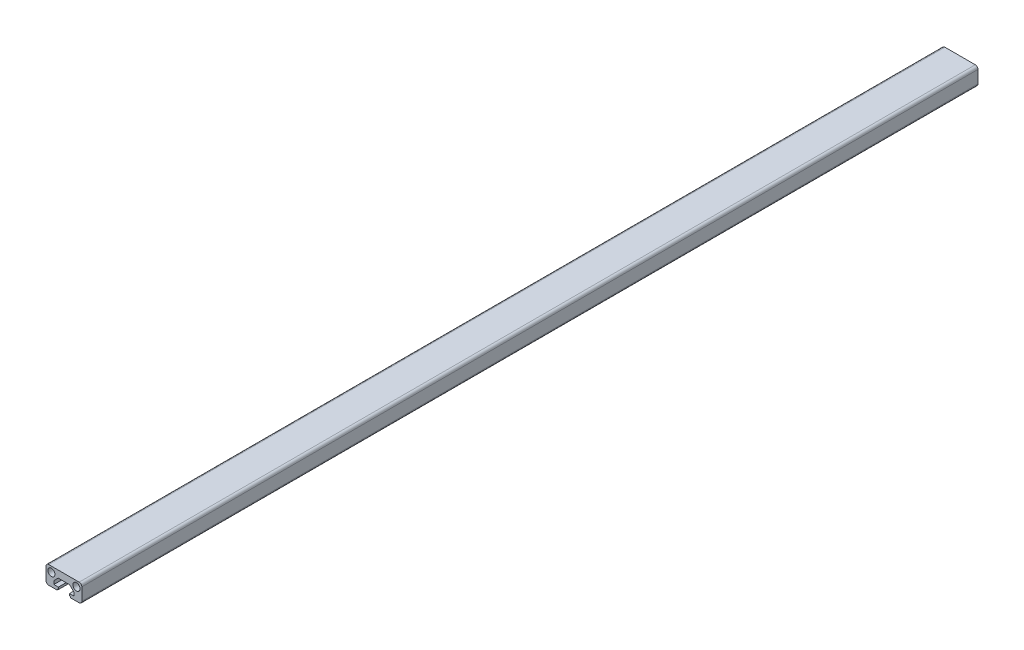
ISO-10303-21;
HEADER;
FILE_DESCRIPTION(('STEP AP214'),'2;1');
FILE_NAME('part.step','',(''),(''),'','','');
FILE_SCHEMA(('AUTOMOTIVE_DESIGN { 1 0 10303 214 1 1 1 1 }'));
ENDSEC;
DATA;
#1=APPLICATION_CONTEXT('core data for automotive mechanical design processes');
#2=APPLICATION_PROTOCOL_DEFINITION('international standard','automotive_design',2000,#1);
#3=PRODUCT_CONTEXT('',#1,'mechanical');
#4=PRODUCT('Part','Part','',(#3));
#5=PRODUCT_RELATED_PRODUCT_CATEGORY('part','',(#4));
#6=PRODUCT_DEFINITION_FORMATION('','',#4);
#7=PRODUCT_DEFINITION_CONTEXT('part definition',#1,'design');
#8=PRODUCT_DEFINITION('design','',#6,#7);
#9=PRODUCT_DEFINITION_SHAPE('','',#8);
#10=(LENGTH_UNIT() NAMED_UNIT(*) SI_UNIT(.MILLI.,.METRE.));
#11=(NAMED_UNIT(*) PLANE_ANGLE_UNIT() SI_UNIT($,.RADIAN.));
#12=(NAMED_UNIT(*) SI_UNIT($,.STERADIAN.) SOLID_ANGLE_UNIT());
#13=UNCERTAINTY_MEASURE_WITH_UNIT(LENGTH_MEASURE(1.E-05),#10,'distance_accuracy_value','');
#14=(GEOMETRIC_REPRESENTATION_CONTEXT(3) GLOBAL_UNCERTAINTY_ASSIGNED_CONTEXT((#13)) GLOBAL_UNIT_ASSIGNED_CONTEXT((#10,
#11,#12)) REPRESENTATION_CONTEXT('',''));
#15=CARTESIAN_POINT('',(0.,0.,0.));
#16=DIRECTION('',(0.,0.,1.));
#17=DIRECTION('',(1.,0.,0.));
#18=AXIS2_PLACEMENT_3D('',#15,#16,#17);
#19=CARTESIAN_POINT('',(3.95000000000001,0.300000000000022,250.));
#20=DIRECTION('',(0.,0.,1.));
#21=DIRECTION('',(1.,0.,0.));
#22=AXIS2_PLACEMENT_3D('',#19,#20,#21);
#23=PLANE('',#22);
#24=CARTESIAN_POINT('',(-7.,7.,250.));
#25=DIRECTION('',(0.,0.,1.));
#26=DIRECTION('',(1.,0.,0.));
#27=AXIS2_PLACEMENT_3D('',#24,#25,#26);
#28=CIRCLE('',#27,2.);
#29=CARTESIAN_POINT('',(-5.,7.,250.));
#30=VERTEX_POINT('',#29);
#31=EDGE_CURVE('E234',#30,#30,#28,.T.);
#32=ORIENTED_EDGE('',*,*,#31,.F.);
#33=EDGE_LOOP('',(#32));
#34=FACE_BOUND('',#33,.T.);
#35=DIRECTION('',(1.,0.,0.));
#36=VECTOR('',#35,1.);
#37=CARTESIAN_POINT('',(-3.65,0.6,250.));
#38=LINE('',#37,#36);
#39=CARTESIAN_POINT('',(-3.65,0.6,250.));
#40=VERTEX_POINT('',#39);
#41=CARTESIAN_POINT('',(-3.1,0.6,250.));
#42=VERTEX_POINT('',#41);
#43=EDGE_CURVE('E277',#40,#42,#38,.T.);
#44=ORIENTED_EDGE('',*,*,#43,.T.);
#45=DIRECTION('',(0.,1.,0.));
#46=VECTOR('',#45,1.);
#47=CARTESIAN_POINT('',(-3.1,0.6,250.));
#48=LINE('',#47,#46);
#49=CARTESIAN_POINT('',(-3.1,1.8,250.));
#50=VERTEX_POINT('',#49);
#51=EDGE_CURVE('E145',#42,#50,#48,.T.);
#52=ORIENTED_EDGE('',*,*,#51,.T.);
#53=DIRECTION('',(-1.,0.,0.));
#54=VECTOR('',#53,1.);
#55=CARTESIAN_POINT('',(-3.1,1.8,250.));
#56=LINE('',#55,#54);
#57=CARTESIAN_POINT('',(-5.6,1.8,250.));
#58=VERTEX_POINT('',#57);
#59=EDGE_CURVE('E340',#50,#58,#56,.T.);
#60=ORIENTED_EDGE('',*,*,#59,.T.);
#61=DIRECTION('',(0.,1.,0.));
#62=VECTOR('',#61,1.);
#63=CARTESIAN_POINT('',(-5.6,1.8,250.));
#64=LINE('',#63,#62);
#65=CARTESIAN_POINT('',(-5.6,3.69289321881342,250.));
#66=VERTEX_POINT('',#65);
#67=EDGE_CURVE('E359',#58,#66,#64,.T.);
#68=ORIENTED_EDGE('',*,*,#67,.T.);
#69=DIRECTION('',(0.707106781186543,0.707106781186552,0.));
#70=VECTOR('',#69,1.);
#71=CARTESIAN_POINT('',(-5.6,3.69289321881342,250.));
#72=LINE('',#71,#70);
#73=CARTESIAN_POINT('',(-3.19289321881345,6.1,250.));
#74=VERTEX_POINT('',#73);
#75=EDGE_CURVE('E356',#66,#74,#72,.T.);
#76=ORIENTED_EDGE('',*,*,#75,.T.);
#77=DIRECTION('',(1.,0.,0.));
#78=VECTOR('',#77,1.);
#79=CARTESIAN_POINT('',(-3.19289321881345,6.1,250.));
#80=LINE('',#79,#78);
#81=CARTESIAN_POINT('',(3.19289321881345,6.1,250.));
#82=VERTEX_POINT('',#81);
#83=EDGE_CURVE('E358',#74,#82,#80,.T.);
#84=ORIENTED_EDGE('',*,*,#83,.T.);
#85=DIRECTION('',(0.707106781186544,-0.707106781186551,0.));
#86=VECTOR('',#85,1.);
#87=CARTESIAN_POINT('',(5.6,3.69289321881343,250.));
#88=LINE('',#87,#86);
#89=CARTESIAN_POINT('',(5.6,3.69289321881343,250.));
#90=VERTEX_POINT('',#89);
#91=EDGE_CURVE('E361',#82,#90,#88,.T.);
#92=ORIENTED_EDGE('',*,*,#91,.T.);
#93=DIRECTION('',(0.,-1.,0.));
#94=VECTOR('',#93,1.);
#95=CARTESIAN_POINT('',(5.6,1.8,250.));
#96=LINE('',#95,#94);
#97=CARTESIAN_POINT('',(5.6,1.8,250.));
#98=VERTEX_POINT('',#97);
#99=EDGE_CURVE('E367',#90,#98,#96,.T.);
#100=ORIENTED_EDGE('',*,*,#99,.T.);
#101=DIRECTION('',(-1.,0.,0.));
#102=VECTOR('',#101,1.);
#103=CARTESIAN_POINT('',(3.1,1.8,250.));
#104=LINE('',#103,#102);
#105=CARTESIAN_POINT('',(3.1,1.8,250.));
#106=VERTEX_POINT('',#105);
#107=EDGE_CURVE('E369',#98,#106,#104,.T.);
#108=ORIENTED_EDGE('',*,*,#107,.T.);
#109=DIRECTION('',(0.,-1.,0.));
#110=VECTOR('',#109,1.);
#111=CARTESIAN_POINT('',(3.1,0.6,250.));
#112=LINE('',#111,#110);
#113=CARTESIAN_POINT('',(3.1,0.6,250.));
#114=VERTEX_POINT('',#113);
#115=EDGE_CURVE('E371',#106,#114,#112,.T.);
#116=ORIENTED_EDGE('',*,*,#115,.T.);
#117=DIRECTION('',(1.,0.,0.));
#118=VECTOR('',#117,1.);
#119=CARTESIAN_POINT('',(3.65,0.6,250.));
#120=LINE('',#119,#118);
#121=CARTESIAN_POINT('',(3.65,0.6,250.));
#122=VERTEX_POINT('',#121);
#123=EDGE_CURVE('E373',#114,#122,#120,.T.);
#124=ORIENTED_EDGE('',*,*,#123,.T.);
#125=DIRECTION('',(0.,-1.,0.));
#126=VECTOR('',#125,1.);
#127=CARTESIAN_POINT('',(3.65,0.300000000000022,250.));
#128=LINE('',#127,#126);
#129=CARTESIAN_POINT('',(3.64999999999999,0.300000000000023,250.));
#130=VERTEX_POINT('',#129);
#131=EDGE_CURVE('E375',#122,#130,#128,.T.);
#132=ORIENTED_EDGE('',*,*,#131,.T.);
#133=CARTESIAN_POINT('',(3.95000000000001,0.300000000000022,250.));
#134=DIRECTION('',(0.,0.,1.));
#135=DIRECTION('',(1.,0.,0.));
#136=AXIS2_PLACEMENT_3D('',#133,#134,#135);
#137=CIRCLE('',#136,0.300000000000016);
#138=CARTESIAN_POINT('',(3.95000000000006,0.,250.));
#139=VERTEX_POINT('',#138);
#140=EDGE_CURVE('E377',#130,#139,#137,.T.);
#141=ORIENTED_EDGE('',*,*,#140,.T.);
#142=DIRECTION('',(1.,0.,0.));
#143=VECTOR('',#142,1.);
#144=CARTESIAN_POINT('',(8.49999999999999,0.,250.));
#145=LINE('',#144,#143);
#146=CARTESIAN_POINT('',(8.49999999999999,0.,250.));
#147=VERTEX_POINT('',#146);
#148=EDGE_CURVE('E379',#139,#147,#145,.T.);
#149=ORIENTED_EDGE('',*,*,#148,.T.);
#150=CARTESIAN_POINT('',(8.5,1.5,250.));
#151=DIRECTION('',(0.,0.,1.));
#152=DIRECTION('',(1.,0.,0.));
#153=AXIS2_PLACEMENT_3D('',#150,#151,#152);
#154=CIRCLE('',#153,1.5);
#155=CARTESIAN_POINT('',(10.,1.50000000000001,250.));
#156=VERTEX_POINT('',#155);
#157=EDGE_CURVE('E381',#147,#156,#154,.T.);
#158=ORIENTED_EDGE('',*,*,#157,.T.);
#159=DIRECTION('',(0.,1.,0.));
#160=VECTOR('',#159,1.);
#161=CARTESIAN_POINT('',(10.,8.49999999999999,250.));
#162=LINE('',#161,#160);
#163=CARTESIAN_POINT('',(10.,8.49999999999999,250.));
#164=VERTEX_POINT('',#163);
#165=EDGE_CURVE('E383',#156,#164,#162,.T.);
#166=ORIENTED_EDGE('',*,*,#165,.T.);
#167=CARTESIAN_POINT('',(8.5,8.5,250.));
#168=DIRECTION('',(0.,0.,1.));
#169=DIRECTION('',(-1.,0.,0.));
#170=AXIS2_PLACEMENT_3D('',#167,#168,#169);
#171=CIRCLE('',#170,1.5);
#172=CARTESIAN_POINT('',(8.49999999999999,10.,250.));
#173=VERTEX_POINT('',#172);
#174=EDGE_CURVE('E385',#164,#173,#171,.T.);
#175=ORIENTED_EDGE('',*,*,#174,.T.);
#176=DIRECTION('',(-1.,0.,0.));
#177=VECTOR('',#176,1.);
#178=CARTESIAN_POINT('',(8.49999999999999,10.,250.));
#179=LINE('',#178,#177);
#180=CARTESIAN_POINT('',(-8.49999999999999,10.,250.));
#181=VERTEX_POINT('',#180);
#182=EDGE_CURVE('E387',#173,#181,#179,.T.);
#183=ORIENTED_EDGE('',*,*,#182,.T.);
#184=CARTESIAN_POINT('',(-8.5,8.5,250.));
#185=DIRECTION('',(0.,0.,1.));
#186=DIRECTION('',(1.,0.,0.));
#187=AXIS2_PLACEMENT_3D('',#184,#185,#186);
#188=CIRCLE('',#187,1.5);
#189=CARTESIAN_POINT('',(-10.,8.49999999999999,250.));
#190=VERTEX_POINT('',#189);
#191=EDGE_CURVE('E389',#181,#190,#188,.T.);
#192=ORIENTED_EDGE('',*,*,#191,.T.);
#193=DIRECTION('',(0.,-1.,0.));
#194=VECTOR('',#193,1.);
#195=CARTESIAN_POINT('',(-10.,8.49999999999999,250.));
#196=LINE('',#195,#194);
#197=CARTESIAN_POINT('',(-10.,1.5,250.));
#198=VERTEX_POINT('',#197);
#199=EDGE_CURVE('E391',#190,#198,#196,.T.);
#200=ORIENTED_EDGE('',*,*,#199,.T.);
#201=CARTESIAN_POINT('',(-8.5,1.5,250.));
#202=DIRECTION('',(0.,0.,1.));
#203=DIRECTION('',(-1.,0.,0.));
#204=AXIS2_PLACEMENT_3D('',#201,#202,#203);
#205=CIRCLE('',#204,1.5);
#206=CARTESIAN_POINT('',(-8.49999999999999,0.,250.));
#207=VERTEX_POINT('',#206);
#208=EDGE_CURVE('E212',#198,#207,#205,.T.);
#209=ORIENTED_EDGE('',*,*,#208,.T.);
#210=DIRECTION('',(1.,0.,0.));
#211=VECTOR('',#210,1.);
#212=CARTESIAN_POINT('',(-8.49999999999999,0.,250.));
#213=LINE('',#212,#211);
#214=CARTESIAN_POINT('',(-3.95000000000006,0.,250.));
#215=VERTEX_POINT('',#214);
#216=EDGE_CURVE('E206',#207,#215,#213,.T.);
#217=ORIENTED_EDGE('',*,*,#216,.T.);
#218=CARTESIAN_POINT('',(-3.95000000000001,0.300000000000022,250.));
#219=DIRECTION('',(0.,0.,1.));
#220=DIRECTION('',(1.,0.,0.));
#221=AXIS2_PLACEMENT_3D('',#218,#219,#220);
#222=CIRCLE('',#221,0.300000000000016);
#223=CARTESIAN_POINT('',(-3.65,0.300000000000022,250.));
#224=VERTEX_POINT('',#223);
#225=EDGE_CURVE('E210',#215,#224,#222,.T.);
#226=ORIENTED_EDGE('',*,*,#225,.T.);
#227=DIRECTION('',(0.,1.,0.));
#228=VECTOR('',#227,1.);
#229=CARTESIAN_POINT('',(-3.65,0.300000000000022,250.));
#230=LINE('',#229,#228);
#231=EDGE_CURVE('E54',#224,#40,#230,.T.);
#232=ORIENTED_EDGE('',*,*,#231,.T.);
#233=EDGE_LOOP('',(#44,#52,#60,#68,#76,#84,#92,#100,#108,#116,#124,#132,#141,#149,#158,#166,
#175,#183,#192,#200,#209,#217,#226,#232));
#234=FACE_BOUND('',#233,.T.);
#235=CARTESIAN_POINT('',(7.,7.,250.));
#236=DIRECTION('',(0.,0.,1.));
#237=DIRECTION('',(-1.,0.,0.));
#238=AXIS2_PLACEMENT_3D('',#235,#236,#237);
#239=CIRCLE('',#238,2.);
#240=CARTESIAN_POINT('',(5.,7.,250.));
#241=VERTEX_POINT('',#240);
#242=EDGE_CURVE('E433',#241,#241,#239,.T.);
#243=ORIENTED_EDGE('',*,*,#242,.F.);
#244=EDGE_LOOP('',(#243));
#245=FACE_BOUND('',#244,.T.);
#246=ADVANCED_FACE('F37',(#34,#234,#245),#23,.T.);
#247=CARTESIAN_POINT('',(3.95000000000001,0.300000000000022,-250.));
#248=DIRECTION('',(0.,0.,1.));
#249=DIRECTION('',(1.,0.,0.));
#250=AXIS2_PLACEMENT_3D('',#247,#248,#249);
#251=PLANE('',#250);
#252=DIRECTION('',(1.,0.,0.));
#253=VECTOR('',#252,1.);
#254=CARTESIAN_POINT('',(-3.65,0.6,-250.));
#255=LINE('',#254,#253);
#256=CARTESIAN_POINT('',(-3.65,0.6,-250.));
#257=VERTEX_POINT('',#256);
#258=CARTESIAN_POINT('',(-3.1,0.6,-250.));
#259=VERTEX_POINT('',#258);
#260=EDGE_CURVE('E230',#257,#259,#255,.T.);
#261=ORIENTED_EDGE('',*,*,#260,.F.);
#262=DIRECTION('',(0.,1.,0.));
#263=VECTOR('',#262,1.);
#264=CARTESIAN_POINT('',(-3.65,0.300000000000022,-250.));
#265=LINE('',#264,#263);
#266=CARTESIAN_POINT('',(-3.65,0.300000000000022,-250.));
#267=VERTEX_POINT('',#266);
#268=EDGE_CURVE('E137',#267,#257,#265,.T.);
#269=ORIENTED_EDGE('',*,*,#268,.F.);
#270=CARTESIAN_POINT('',(-3.95000000000001,0.300000000000022,-250.));
#271=DIRECTION('',(0.,0.,1.));
#272=DIRECTION('',(1.,0.,0.));
#273=AXIS2_PLACEMENT_3D('',#270,#271,#272);
#274=CIRCLE('',#273,0.300000000000016);
#275=CARTESIAN_POINT('',(-3.95000000000006,0.,-250.));
#276=VERTEX_POINT('',#275);
#277=EDGE_CURVE('E131',#276,#267,#274,.T.);
#278=ORIENTED_EDGE('',*,*,#277,.F.);
#279=DIRECTION('',(1.,0.,0.));
#280=VECTOR('',#279,1.);
#281=CARTESIAN_POINT('',(-8.49999999999999,0.,-250.));
#282=LINE('',#281,#280);
#283=CARTESIAN_POINT('',(-8.49999999999999,0.,-250.));
#284=VERTEX_POINT('',#283);
#285=EDGE_CURVE('E220',#284,#276,#282,.T.);
#286=ORIENTED_EDGE('',*,*,#285,.F.);
#287=CARTESIAN_POINT('',(-8.5,1.5,-250.));
#288=DIRECTION('',(0.,0.,1.));
#289=DIRECTION('',(-1.,0.,0.));
#290=AXIS2_PLACEMENT_3D('',#287,#288,#289);
#291=CIRCLE('',#290,1.5);
#292=CARTESIAN_POINT('',(-10.,1.5,-250.));
#293=VERTEX_POINT('',#292);
#294=EDGE_CURVE('E272',#293,#284,#291,.T.);
#295=ORIENTED_EDGE('',*,*,#294,.F.);
#296=DIRECTION('',(0.,-1.,0.));
#297=VECTOR('',#296,1.);
#298=CARTESIAN_POINT('',(-10.,8.49999999999999,-250.));
#299=LINE('',#298,#297);
#300=CARTESIAN_POINT('',(-10.,8.49999999999999,-250.));
#301=VERTEX_POINT('',#300);
#302=EDGE_CURVE('E270',#301,#293,#299,.T.);
#303=ORIENTED_EDGE('',*,*,#302,.F.);
#304=CARTESIAN_POINT('',(-8.5,8.5,-250.));
#305=DIRECTION('',(0.,0.,1.));
#306=DIRECTION('',(1.,0.,0.));
#307=AXIS2_PLACEMENT_3D('',#304,#305,#306);
#308=CIRCLE('',#307,1.5);
#309=CARTESIAN_POINT('',(-8.49999999999999,10.,-250.));
#310=VERTEX_POINT('',#309);
#311=EDGE_CURVE('E268',#310,#301,#308,.T.);
#312=ORIENTED_EDGE('',*,*,#311,.F.);
#313=DIRECTION('',(-1.,0.,0.));
#314=VECTOR('',#313,1.);
#315=CARTESIAN_POINT('',(8.49999999999999,10.,-250.));
#316=LINE('',#315,#314);
#317=CARTESIAN_POINT('',(8.49999999999999,10.,-250.));
#318=VERTEX_POINT('',#317);
#319=EDGE_CURVE('E266',#318,#310,#316,.T.);
#320=ORIENTED_EDGE('',*,*,#319,.F.);
#321=CARTESIAN_POINT('',(8.5,8.5,-250.));
#322=DIRECTION('',(0.,0.,1.));
#323=DIRECTION('',(-1.,0.,0.));
#324=AXIS2_PLACEMENT_3D('',#321,#322,#323);
#325=CIRCLE('',#324,1.5);
#326=CARTESIAN_POINT('',(10.,8.49999999999999,-250.));
#327=VERTEX_POINT('',#326);
#328=EDGE_CURVE('E264',#327,#318,#325,.T.);
#329=ORIENTED_EDGE('',*,*,#328,.F.);
#330=DIRECTION('',(0.,1.,0.));
#331=VECTOR('',#330,1.);
#332=CARTESIAN_POINT('',(10.,8.49999999999999,-250.));
#333=LINE('',#332,#331);
#334=CARTESIAN_POINT('',(10.,1.50000000000001,-250.));
#335=VERTEX_POINT('',#334);
#336=EDGE_CURVE('E262',#335,#327,#333,.T.);
#337=ORIENTED_EDGE('',*,*,#336,.F.);
#338=CARTESIAN_POINT('',(8.5,1.5,-250.));
#339=DIRECTION('',(0.,0.,1.));
#340=DIRECTION('',(1.,0.,0.));
#341=AXIS2_PLACEMENT_3D('',#338,#339,#340);
#342=CIRCLE('',#341,1.5);
#343=CARTESIAN_POINT('',(8.49999999999999,0.,-250.));
#344=VERTEX_POINT('',#343);
#345=EDGE_CURVE('E260',#344,#335,#342,.T.);
#346=ORIENTED_EDGE('',*,*,#345,.F.);
#347=DIRECTION('',(1.,0.,0.));
#348=VECTOR('',#347,1.);
#349=CARTESIAN_POINT('',(8.49999999999999,0.,-250.));
#350=LINE('',#349,#348);
#351=CARTESIAN_POINT('',(3.95000000000006,0.,-250.));
#352=VERTEX_POINT('',#351);
#353=EDGE_CURVE('E258',#352,#344,#350,.T.);
#354=ORIENTED_EDGE('',*,*,#353,.F.);
#355=CARTESIAN_POINT('',(3.95000000000001,0.300000000000022,-250.));
#356=DIRECTION('',(0.,0.,1.));
#357=DIRECTION('',(1.,0.,0.));
#358=AXIS2_PLACEMENT_3D('',#355,#356,#357);
#359=CIRCLE('',#358,0.300000000000016);
#360=CARTESIAN_POINT('',(3.64999999999999,0.300000000000023,-250.));
#361=VERTEX_POINT('',#360);
#362=EDGE_CURVE('E256',#361,#352,#359,.T.);
#363=ORIENTED_EDGE('',*,*,#362,.F.);
#364=DIRECTION('',(0.,-1.,0.));
#365=VECTOR('',#364,1.);
#366=CARTESIAN_POINT('',(3.65,0.300000000000022,-250.));
#367=LINE('',#366,#365);
#368=CARTESIAN_POINT('',(3.65,0.6,-250.));
#369=VERTEX_POINT('',#368);
#370=EDGE_CURVE('E254',#369,#361,#367,.T.);
#371=ORIENTED_EDGE('',*,*,#370,.F.);
#372=DIRECTION('',(1.,0.,0.));
#373=VECTOR('',#372,1.);
#374=CARTESIAN_POINT('',(3.65,0.6,-250.));
#375=LINE('',#374,#373);
#376=CARTESIAN_POINT('',(3.1,0.6,-250.));
#377=VERTEX_POINT('',#376);
#378=EDGE_CURVE('E252',#377,#369,#375,.T.);
#379=ORIENTED_EDGE('',*,*,#378,.F.);
#380=DIRECTION('',(0.,-1.,0.));
#381=VECTOR('',#380,1.);
#382=CARTESIAN_POINT('',(3.1,0.6,-250.));
#383=LINE('',#382,#381);
#384=CARTESIAN_POINT('',(3.1,1.8,-250.));
#385=VERTEX_POINT('',#384);
#386=EDGE_CURVE('E250',#385,#377,#383,.T.);
#387=ORIENTED_EDGE('',*,*,#386,.F.);
#388=DIRECTION('',(-1.,0.,0.));
#389=VECTOR('',#388,1.);
#390=CARTESIAN_POINT('',(3.1,1.8,-250.));
#391=LINE('',#390,#389);
#392=CARTESIAN_POINT('',(5.6,1.8,-250.));
#393=VERTEX_POINT('',#392);
#394=EDGE_CURVE('E248',#393,#385,#391,.T.);
#395=ORIENTED_EDGE('',*,*,#394,.F.);
#396=DIRECTION('',(0.,-1.,0.));
#397=VECTOR('',#396,1.);
#398=CARTESIAN_POINT('',(5.6,1.8,-250.));
#399=LINE('',#398,#397);
#400=CARTESIAN_POINT('',(5.6,3.69289321881343,-250.));
#401=VERTEX_POINT('',#400);
#402=EDGE_CURVE('E246',#401,#393,#399,.T.);
#403=ORIENTED_EDGE('',*,*,#402,.F.);
#404=DIRECTION('',(0.707106781186544,-0.707106781186551,0.));
#405=VECTOR('',#404,1.);
#406=CARTESIAN_POINT('',(5.6,3.69289321881343,-250.));
#407=LINE('',#406,#405);
#408=CARTESIAN_POINT('',(3.19289321881345,6.1,-250.));
#409=VERTEX_POINT('',#408);
#410=EDGE_CURVE('E244',#409,#401,#407,.T.);
#411=ORIENTED_EDGE('',*,*,#410,.F.);
#412=DIRECTION('',(1.,0.,0.));
#413=VECTOR('',#412,1.);
#414=CARTESIAN_POINT('',(-3.19289321881345,6.1,-250.));
#415=LINE('',#414,#413);
#416=CARTESIAN_POINT('',(-3.19289321881345,6.1,-250.));
#417=VERTEX_POINT('',#416);
#418=EDGE_CURVE('E242',#417,#409,#415,.T.);
#419=ORIENTED_EDGE('',*,*,#418,.F.);
#420=DIRECTION('',(0.707106781186543,0.707106781186552,0.));
#421=VECTOR('',#420,1.);
#422=CARTESIAN_POINT('',(-5.6,3.69289321881342,-250.));
#423=LINE('',#422,#421);
#424=CARTESIAN_POINT('',(-5.6,3.69289321881342,-250.));
#425=VERTEX_POINT('',#424);
#426=EDGE_CURVE('E240',#425,#417,#423,.T.);
#427=ORIENTED_EDGE('',*,*,#426,.F.);
#428=DIRECTION('',(0.,1.,0.));
#429=VECTOR('',#428,1.);
#430=CARTESIAN_POINT('',(-5.6,1.8,-250.));
#431=LINE('',#430,#429);
#432=CARTESIAN_POINT('',(-5.6,1.8,-250.));
#433=VERTEX_POINT('',#432);
#434=EDGE_CURVE('E238',#433,#425,#431,.T.);
#435=ORIENTED_EDGE('',*,*,#434,.F.);
#436=DIRECTION('',(-1.,0.,0.));
#437=VECTOR('',#436,1.);
#438=CARTESIAN_POINT('',(-3.1,1.8,-250.));
#439=LINE('',#438,#437);
#440=CARTESIAN_POINT('',(-3.1,1.8,-250.));
#441=VERTEX_POINT('',#440);
#442=EDGE_CURVE('E236',#441,#433,#439,.T.);
#443=ORIENTED_EDGE('',*,*,#442,.F.);
#444=DIRECTION('',(0.,1.,0.));
#445=VECTOR('',#444,1.);
#446=CARTESIAN_POINT('',(-3.1,0.6,-250.));
#447=LINE('',#446,#445);
#448=EDGE_CURVE('E233',#259,#441,#447,.T.);
#449=ORIENTED_EDGE('',*,*,#448,.F.);
#450=EDGE_LOOP('',(#261,#269,#278,#286,#295,#303,#312,#320,#329,#337,#346,#354,#363,#371,#379,
#387,#395,#403,#411,#419,#427,#435,#443,#449));
#451=FACE_BOUND('',#450,.T.);
#452=CARTESIAN_POINT('',(-7.,7.,-250.));
#453=DIRECTION('',(0.,0.,1.));
#454=DIRECTION('',(1.,0.,0.));
#455=AXIS2_PLACEMENT_3D('',#452,#453,#454);
#456=CIRCLE('',#455,2.);
#457=CARTESIAN_POINT('',(-5.,7.,-250.));
#458=VERTEX_POINT('',#457);
#459=EDGE_CURVE('E439',#458,#458,#456,.T.);
#460=ORIENTED_EDGE('',*,*,#459,.T.);
#461=EDGE_LOOP('',(#460));
#462=FACE_BOUND('',#461,.T.);
#463=CARTESIAN_POINT('',(7.,7.,-250.));
#464=DIRECTION('',(0.,0.,1.));
#465=DIRECTION('',(-1.,0.,0.));
#466=AXIS2_PLACEMENT_3D('',#463,#464,#465);
#467=CIRCLE('',#466,2.);
#468=CARTESIAN_POINT('',(5.,7.,-250.));
#469=VERTEX_POINT('',#468);
#470=EDGE_CURVE('E436',#469,#469,#467,.T.);
#471=ORIENTED_EDGE('',*,*,#470,.T.);
#472=EDGE_LOOP('',(#471));
#473=FACE_BOUND('',#472,.T.);
#474=ADVANCED_FACE('F344',(#451,#462,#473),#251,.F.);
#475=CARTESIAN_POINT('',(-3.65,0.6,250.));
#476=DIRECTION('',(0.,1.,0.));
#477=DIRECTION('',(0.,0.,1.));
#478=AXIS2_PLACEMENT_3D('',#475,#476,#477);
#479=PLANE('',#478);
#480=ORIENTED_EDGE('',*,*,#260,.T.);
#481=DIRECTION('',(0.,0.,-1.));
#482=VECTOR('',#481,1.);
#483=CARTESIAN_POINT('',(-3.1,0.6,250.));
#484=LINE('',#483,#482);
#485=EDGE_CURVE('E11',#42,#259,#484,.T.);
#486=ORIENTED_EDGE('',*,*,#485,.F.);
#487=ORIENTED_EDGE('',*,*,#43,.F.);
#488=DIRECTION('',(0.,0.,-1.));
#489=VECTOR('',#488,1.);
#490=CARTESIAN_POINT('',(-3.65,0.6,250.));
#491=LINE('',#490,#489);
#492=EDGE_CURVE('E226',#40,#257,#491,.T.);
#493=ORIENTED_EDGE('',*,*,#492,.T.);
#494=EDGE_LOOP('',(#480,#486,#487,#493));
#495=FACE_BOUND('',#494,.T.);
#496=ADVANCED_FACE('F39',(#495),#479,.F.);
#497=CARTESIAN_POINT('',(-3.1,0.6,250.));
#498=DIRECTION('',(-1.,0.,0.));
#499=DIRECTION('',(0.,0.,1.));
#500=AXIS2_PLACEMENT_3D('',#497,#498,#499);
#501=PLANE('',#500);
#502=ORIENTED_EDGE('',*,*,#448,.T.);
#503=DIRECTION('',(0.,0.,-1.));
#504=VECTOR('',#503,1.);
#505=CARTESIAN_POINT('',(-3.1,1.8,250.));
#506=LINE('',#505,#504);
#507=EDGE_CURVE('E46',#50,#441,#506,.T.);
#508=ORIENTED_EDGE('',*,*,#507,.F.);
#509=ORIENTED_EDGE('',*,*,#51,.F.);
#510=ORIENTED_EDGE('',*,*,#485,.T.);
#511=EDGE_LOOP('',(#502,#508,#509,#510));
#512=FACE_BOUND('',#511,.T.);
#513=ADVANCED_FACE('F676',(#512),#501,.F.);
#514=CARTESIAN_POINT('',(-3.1,1.8,250.));
#515=DIRECTION('',(0.,-1.,0.));
#516=DIRECTION('',(1.,0.,0.));
#517=AXIS2_PLACEMENT_3D('',#514,#515,#516);
#518=PLANE('',#517);
#519=ORIENTED_EDGE('',*,*,#442,.T.);
#520=DIRECTION('',(0.,0.,-1.));
#521=VECTOR('',#520,1.);
#522=CARTESIAN_POINT('',(-5.6,1.8,250.));
#523=LINE('',#522,#521);
#524=EDGE_CURVE('E332',#58,#433,#523,.T.);
#525=ORIENTED_EDGE('',*,*,#524,.F.);
#526=ORIENTED_EDGE('',*,*,#59,.F.);
#527=ORIENTED_EDGE('',*,*,#507,.T.);
#528=EDGE_LOOP('',(#519,#525,#526,#527));
#529=FACE_BOUND('',#528,.T.);
#530=ADVANCED_FACE('F338',(#529),#518,.F.);
#531=CARTESIAN_POINT('',(-5.6,1.8,250.));
#532=DIRECTION('',(-1.,0.,0.));
#533=DIRECTION('',(0.,-1.,0.));
#534=AXIS2_PLACEMENT_3D('',#531,#532,#533);
#535=PLANE('',#534);
#536=ORIENTED_EDGE('',*,*,#434,.T.);
#537=DIRECTION('',(0.,0.,-1.));
#538=VECTOR('',#537,1.);
#539=CARTESIAN_POINT('',(-5.6,3.69289321881342,250.));
#540=LINE('',#539,#538);
#541=EDGE_CURVE('E329',#66,#425,#540,.T.);
#542=ORIENTED_EDGE('',*,*,#541,.F.);
#543=ORIENTED_EDGE('',*,*,#67,.F.);
#544=ORIENTED_EDGE('',*,*,#524,.T.);
#545=EDGE_LOOP('',(#536,#542,#543,#544));
#546=FACE_BOUND('',#545,.T.);
#547=ADVANCED_FACE('F350',(#546),#535,.F.);
#548=CARTESIAN_POINT('',(-5.6,3.69289321881342,250.));
#549=DIRECTION('',(-0.707106781186552,0.707106781186543,0.));
#550=DIRECTION('',(-0.707106781186543,-0.707106781186552,0.));
#551=AXIS2_PLACEMENT_3D('',#548,#549,#550);
#552=PLANE('',#551);
#553=ORIENTED_EDGE('',*,*,#426,.T.);
#554=DIRECTION('',(0.,0.,-1.));
#555=VECTOR('',#554,1.);
#556=CARTESIAN_POINT('',(-3.19289321881345,6.1,250.));
#557=LINE('',#556,#555);
#558=EDGE_CURVE('E326',#74,#417,#557,.T.);
#559=ORIENTED_EDGE('',*,*,#558,.F.);
#560=ORIENTED_EDGE('',*,*,#75,.F.);
#561=ORIENTED_EDGE('',*,*,#541,.T.);
#562=EDGE_LOOP('',(#553,#559,#560,#561));
#563=FACE_BOUND('',#562,.T.);
#564=ADVANCED_FACE('F354',(#563),#552,.F.);
#565=CARTESIAN_POINT('',(-3.19289321881345,6.1,250.));
#566=DIRECTION('',(0.,1.,0.));
#567=DIRECTION('',(0.,0.,1.));
#568=AXIS2_PLACEMENT_3D('',#565,#566,#567);
#569=PLANE('',#568);
#570=ORIENTED_EDGE('',*,*,#418,.T.);
#571=DIRECTION('',(0.,0.,-1.));
#572=VECTOR('',#571,1.);
#573=CARTESIAN_POINT('',(3.19289321881345,6.1,250.));
#574=LINE('',#573,#572);
#575=EDGE_CURVE('E323',#82,#409,#574,.T.);
#576=ORIENTED_EDGE('',*,*,#575,.F.);
#577=ORIENTED_EDGE('',*,*,#83,.F.);
#578=ORIENTED_EDGE('',*,*,#558,.T.);
#579=EDGE_LOOP('',(#570,#576,#577,#578));
#580=FACE_BOUND('',#579,.T.);
#581=ADVANCED_FACE('F637',(#580),#569,.F.);
#582=CARTESIAN_POINT('',(5.6,3.69289321881343,250.));
#583=DIRECTION('',(0.707106781186551,0.707106781186544,0.));
#584=DIRECTION('',(-0.707106781186544,0.707106781186551,0.));
#585=AXIS2_PLACEMENT_3D('',#582,#583,#584);
#586=PLANE('',#585);
#587=ORIENTED_EDGE('',*,*,#410,.T.);
#588=DIRECTION('',(0.,0.,-1.));
#589=VECTOR('',#588,1.);
#590=CARTESIAN_POINT('',(5.6,3.69289321881343,250.));
#591=LINE('',#590,#589);
#592=EDGE_CURVE('E320',#90,#401,#591,.T.);
#593=ORIENTED_EDGE('',*,*,#592,.F.);
#594=ORIENTED_EDGE('',*,*,#91,.F.);
#595=ORIENTED_EDGE('',*,*,#575,.T.);
#596=EDGE_LOOP('',(#587,#593,#594,#595));
#597=FACE_BOUND('',#596,.T.);
#598=ADVANCED_FACE('F627',(#597),#586,.F.);
#599=CARTESIAN_POINT('',(5.6,1.8,250.));
#600=DIRECTION('',(1.,0.,0.));
#601=DIRECTION('',(0.,1.,0.));
#602=AXIS2_PLACEMENT_3D('',#599,#600,#601);
#603=PLANE('',#602);
#604=ORIENTED_EDGE('',*,*,#402,.T.);
#605=DIRECTION('',(0.,0.,-1.));
#606=VECTOR('',#605,1.);
#607=CARTESIAN_POINT('',(5.6,1.8,250.));
#608=LINE('',#607,#606);
#609=EDGE_CURVE('E317',#98,#393,#608,.T.);
#610=ORIENTED_EDGE('',*,*,#609,.F.);
#611=ORIENTED_EDGE('',*,*,#99,.F.);
#612=ORIENTED_EDGE('',*,*,#592,.T.);
#613=EDGE_LOOP('',(#604,#610,#611,#612));
#614=FACE_BOUND('',#613,.T.);
#615=ADVANCED_FACE('F616',(#614),#603,.F.);
#616=CARTESIAN_POINT('',(3.1,1.8,250.));
#617=DIRECTION('',(0.,-1.,0.));
#618=DIRECTION('',(1.,0.,0.));
#619=AXIS2_PLACEMENT_3D('',#616,#617,#618);
#620=PLANE('',#619);
#621=ORIENTED_EDGE('',*,*,#394,.T.);
#622=DIRECTION('',(0.,0.,-1.));
#623=VECTOR('',#622,1.);
#624=CARTESIAN_POINT('',(3.1,1.8,250.));
#625=LINE('',#624,#623);
#626=EDGE_CURVE('E314',#106,#385,#625,.T.);
#627=ORIENTED_EDGE('',*,*,#626,.F.);
#628=ORIENTED_EDGE('',*,*,#107,.F.);
#629=ORIENTED_EDGE('',*,*,#609,.T.);
#630=EDGE_LOOP('',(#621,#627,#628,#629));
#631=FACE_BOUND('',#630,.T.);
#632=ADVANCED_FACE('F605',(#631),#620,.F.);
#633=CARTESIAN_POINT('',(3.1,0.6,250.));
#634=DIRECTION('',(1.,0.,0.));
#635=DIRECTION('',(0.,0.,-1.));
#636=AXIS2_PLACEMENT_3D('',#633,#634,#635);
#637=PLANE('',#636);
#638=ORIENTED_EDGE('',*,*,#386,.T.);
#639=DIRECTION('',(0.,0.,-1.));
#640=VECTOR('',#639,1.);
#641=CARTESIAN_POINT('',(3.1,0.6,250.));
#642=LINE('',#641,#640);
#643=EDGE_CURVE('E311',#114,#377,#642,.T.);
#644=ORIENTED_EDGE('',*,*,#643,.F.);
#645=ORIENTED_EDGE('',*,*,#115,.F.);
#646=ORIENTED_EDGE('',*,*,#626,.T.);
#647=EDGE_LOOP('',(#638,#644,#645,#646));
#648=FACE_BOUND('',#647,.T.);
#649=ADVANCED_FACE('F594',(#648),#637,.F.);
#650=CARTESIAN_POINT('',(3.65,0.6,250.));
#651=DIRECTION('',(0.,1.,0.));
#652=DIRECTION('',(0.,0.,1.));
#653=AXIS2_PLACEMENT_3D('',#650,#651,#652);
#654=PLANE('',#653);
#655=ORIENTED_EDGE('',*,*,#378,.T.);
#656=DIRECTION('',(0.,0.,-1.));
#657=VECTOR('',#656,1.);
#658=CARTESIAN_POINT('',(3.65,0.6,250.));
#659=LINE('',#658,#657);
#660=EDGE_CURVE('E308',#122,#369,#659,.T.);
#661=ORIENTED_EDGE('',*,*,#660,.F.);
#662=ORIENTED_EDGE('',*,*,#123,.F.);
#663=ORIENTED_EDGE('',*,*,#643,.T.);
#664=EDGE_LOOP('',(#655,#661,#662,#663));
#665=FACE_BOUND('',#664,.T.);
#666=ADVANCED_FACE('F582',(#665),#654,.F.);
#667=CARTESIAN_POINT('',(3.65,0.300000000000022,250.));
#668=DIRECTION('',(1.,0.,0.));
#669=DIRECTION('',(0.,1.,0.));
#670=AXIS2_PLACEMENT_3D('',#667,#668,#669);
#671=PLANE('',#670);
#672=ORIENTED_EDGE('',*,*,#370,.T.);
#673=DIRECTION('',(0.,0.,-1.));
#674=VECTOR('',#673,1.);
#675=CARTESIAN_POINT('',(3.64999999999999,0.300000000000023,250.));
#676=LINE('',#675,#674);
#677=EDGE_CURVE('E305',#130,#361,#676,.T.);
#678=ORIENTED_EDGE('',*,*,#677,.F.);
#679=ORIENTED_EDGE('',*,*,#131,.F.);
#680=ORIENTED_EDGE('',*,*,#660,.T.);
#681=EDGE_LOOP('',(#672,#678,#679,#680));
#682=FACE_BOUND('',#681,.T.);
#683=ADVANCED_FACE('F571',(#682),#671,.F.);
#684=CARTESIAN_POINT('',(3.95000000000001,0.300000000000022,250.));
#685=DIRECTION('',(0.,0.,-1.));
#686=DIRECTION('',(-1.,0.,0.));
#687=AXIS2_PLACEMENT_3D('',#684,#685,#686);
#688=CYLINDRICAL_SURFACE('',#687,0.300000000000016);
#689=ORIENTED_EDGE('',*,*,#362,.T.);
#690=DIRECTION('',(0.,0.,-1.));
#691=VECTOR('',#690,1.);
#692=CARTESIAN_POINT('',(3.95000000000006,0.,250.));
#693=LINE('',#692,#691);
#694=EDGE_CURVE('E302',#139,#352,#693,.T.);
#695=ORIENTED_EDGE('',*,*,#694,.F.);
#696=ORIENTED_EDGE('',*,*,#140,.F.);
#697=ORIENTED_EDGE('',*,*,#677,.T.);
#698=EDGE_LOOP('',(#689,#695,#696,#697));
#699=FACE_BOUND('',#698,.T.);
#700=ADVANCED_FACE('F561',(#699),#688,.T.);
#701=CARTESIAN_POINT('',(8.49999999999999,0.,250.));
#702=DIRECTION('',(0.,1.,0.));
#703=DIRECTION('',(-1.,0.,0.));
#704=AXIS2_PLACEMENT_3D('',#701,#702,#703);
#705=PLANE('',#704);
#706=ORIENTED_EDGE('',*,*,#353,.T.);
#707=DIRECTION('',(0.,0.,-1.));
#708=VECTOR('',#707,1.);
#709=CARTESIAN_POINT('',(8.49999999999999,0.,250.));
#710=LINE('',#709,#708);
#711=EDGE_CURVE('E299',#147,#344,#710,.T.);
#712=ORIENTED_EDGE('',*,*,#711,.F.);
#713=ORIENTED_EDGE('',*,*,#148,.F.);
#714=ORIENTED_EDGE('',*,*,#694,.T.);
#715=EDGE_LOOP('',(#706,#712,#713,#714));
#716=FACE_BOUND('',#715,.T.);
#717=ADVANCED_FACE('F550',(#716),#705,.F.);
#718=CARTESIAN_POINT('',(8.5,1.5,250.));
#719=DIRECTION('',(0.,0.,-1.));
#720=DIRECTION('',(-1.,0.,0.));
#721=AXIS2_PLACEMENT_3D('',#718,#719,#720);
#722=CYLINDRICAL_SURFACE('',#721,1.5);
#723=ORIENTED_EDGE('',*,*,#345,.T.);
#724=DIRECTION('',(0.,0.,-1.));
#725=VECTOR('',#724,1.);
#726=CARTESIAN_POINT('',(10.,1.50000000000001,250.));
#727=LINE('',#726,#725);
#728=EDGE_CURVE('E296',#156,#335,#727,.T.);
#729=ORIENTED_EDGE('',*,*,#728,.F.);
#730=ORIENTED_EDGE('',*,*,#157,.F.);
#731=ORIENTED_EDGE('',*,*,#711,.T.);
#732=EDGE_LOOP('',(#723,#729,#730,#731));
#733=FACE_BOUND('',#732,.T.);
#734=ADVANCED_FACE('F539',(#733),#722,.T.);
#735=CARTESIAN_POINT('',(10.,8.49999999999999,250.));
#736=DIRECTION('',(-1.,0.,0.));
#737=DIRECTION('',(0.,0.,1.));
#738=AXIS2_PLACEMENT_3D('',#735,#736,#737);
#739=PLANE('',#738);
#740=ORIENTED_EDGE('',*,*,#336,.T.);
#741=DIRECTION('',(0.,0.,-1.));
#742=VECTOR('',#741,1.);
#743=CARTESIAN_POINT('',(10.,8.49999999999999,250.));
#744=LINE('',#743,#742);
#745=EDGE_CURVE('E293',#164,#327,#744,.T.);
#746=ORIENTED_EDGE('',*,*,#745,.F.);
#747=ORIENTED_EDGE('',*,*,#165,.F.);
#748=ORIENTED_EDGE('',*,*,#728,.T.);
#749=EDGE_LOOP('',(#740,#746,#747,#748));
#750=FACE_BOUND('',#749,.T.);
#751=ADVANCED_FACE('F527',(#750),#739,.F.);
#752=CARTESIAN_POINT('',(8.5,8.5,250.));
#753=DIRECTION('',(0.,0.,-1.));
#754=DIRECTION('',(-1.,0.,0.));
#755=AXIS2_PLACEMENT_3D('',#752,#753,#754);
#756=CYLINDRICAL_SURFACE('',#755,1.5);
#757=ORIENTED_EDGE('',*,*,#328,.T.);
#758=DIRECTION('',(0.,0.,-1.));
#759=VECTOR('',#758,1.);
#760=CARTESIAN_POINT('',(8.49999999999999,10.,250.));
#761=LINE('',#760,#759);
#762=EDGE_CURVE('E290',#173,#318,#761,.T.);
#763=ORIENTED_EDGE('',*,*,#762,.F.);
#764=ORIENTED_EDGE('',*,*,#174,.F.);
#765=ORIENTED_EDGE('',*,*,#745,.T.);
#766=EDGE_LOOP('',(#757,#763,#764,#765));
#767=FACE_BOUND('',#766,.T.);
#768=ADVANCED_FACE('F516',(#767),#756,.T.);
#769=CARTESIAN_POINT('',(8.49999999999999,10.,250.));
#770=DIRECTION('',(0.,-1.,0.));
#771=DIRECTION('',(0.,0.,-1.));
#772=AXIS2_PLACEMENT_3D('',#769,#770,#771);
#773=PLANE('',#772);
#774=ORIENTED_EDGE('',*,*,#319,.T.);
#775=DIRECTION('',(0.,0.,-1.));
#776=VECTOR('',#775,1.);
#777=CARTESIAN_POINT('',(-8.49999999999999,10.,250.));
#778=LINE('',#777,#776);
#779=EDGE_CURVE('E287',#181,#310,#778,.T.);
#780=ORIENTED_EDGE('',*,*,#779,.F.);
#781=ORIENTED_EDGE('',*,*,#182,.F.);
#782=ORIENTED_EDGE('',*,*,#762,.T.);
#783=EDGE_LOOP('',(#774,#780,#781,#782));
#784=FACE_BOUND('',#783,.T.);
#785=ADVANCED_FACE('F505',(#784),#773,.F.);
#786=CARTESIAN_POINT('',(-8.5,8.5,250.));
#787=DIRECTION('',(0.,0.,-1.));
#788=DIRECTION('',(-1.,0.,0.));
#789=AXIS2_PLACEMENT_3D('',#786,#787,#788);
#790=CYLINDRICAL_SURFACE('',#789,1.5);
#791=ORIENTED_EDGE('',*,*,#311,.T.);
#792=DIRECTION('',(0.,0.,-1.));
#793=VECTOR('',#792,1.);
#794=CARTESIAN_POINT('',(-10.,8.49999999999999,250.));
#795=LINE('',#794,#793);
#796=EDGE_CURVE('E284',#190,#301,#795,.T.);
#797=ORIENTED_EDGE('',*,*,#796,.F.);
#798=ORIENTED_EDGE('',*,*,#191,.F.);
#799=ORIENTED_EDGE('',*,*,#779,.T.);
#800=EDGE_LOOP('',(#791,#797,#798,#799));
#801=FACE_BOUND('',#800,.T.);
#802=ADVANCED_FACE('F495',(#801),#790,.T.);
#803=CARTESIAN_POINT('',(-10.,8.49999999999999,250.));
#804=DIRECTION('',(1.,0.,0.));
#805=DIRECTION('',(0.,0.,-1.));
#806=AXIS2_PLACEMENT_3D('',#803,#804,#805);
#807=PLANE('',#806);
#808=ORIENTED_EDGE('',*,*,#302,.T.);
#809=DIRECTION('',(0.,0.,-1.));
#810=VECTOR('',#809,1.);
#811=CARTESIAN_POINT('',(-10.,1.5,250.));
#812=LINE('',#811,#810);
#813=EDGE_CURVE('E281',#198,#293,#812,.T.);
#814=ORIENTED_EDGE('',*,*,#813,.F.);
#815=ORIENTED_EDGE('',*,*,#199,.F.);
#816=ORIENTED_EDGE('',*,*,#796,.T.);
#817=EDGE_LOOP('',(#808,#814,#815,#816));
#818=FACE_BOUND('',#817,.T.);
#819=ADVANCED_FACE('F397',(#818),#807,.F.);
#820=CARTESIAN_POINT('',(-8.5,1.5,250.));
#821=DIRECTION('',(0.,0.,-1.));
#822=DIRECTION('',(-1.,0.,0.));
#823=AXIS2_PLACEMENT_3D('',#820,#821,#822);
#824=CYLINDRICAL_SURFACE('',#823,1.5);
#825=ORIENTED_EDGE('',*,*,#294,.T.);
#826=DIRECTION('',(0.,0.,-1.));
#827=VECTOR('',#826,1.);
#828=CARTESIAN_POINT('',(-8.49999999999999,0.,250.));
#829=LINE('',#828,#827);
#830=EDGE_CURVE('E221',#207,#284,#829,.T.);
#831=ORIENTED_EDGE('',*,*,#830,.F.);
#832=ORIENTED_EDGE('',*,*,#208,.F.);
#833=ORIENTED_EDGE('',*,*,#813,.T.);
#834=EDGE_LOOP('',(#825,#831,#832,#833));
#835=FACE_BOUND('',#834,.T.);
#836=ADVANCED_FACE('F401',(#835),#824,.T.);
#837=CARTESIAN_POINT('',(-8.49999999999999,0.,250.));
#838=DIRECTION('',(0.,1.,0.));
#839=DIRECTION('',(-1.,0.,0.));
#840=AXIS2_PLACEMENT_3D('',#837,#838,#839);
#841=PLANE('',#840);
#842=ORIENTED_EDGE('',*,*,#285,.T.);
#843=DIRECTION('',(0.,0.,-1.));
#844=VECTOR('',#843,1.);
#845=CARTESIAN_POINT('',(-3.95000000000006,0.,250.));
#846=LINE('',#845,#844);
#847=EDGE_CURVE('E217',#215,#276,#846,.T.);
#848=ORIENTED_EDGE('',*,*,#847,.F.);
#849=ORIENTED_EDGE('',*,*,#216,.F.);
#850=ORIENTED_EDGE('',*,*,#830,.T.);
#851=EDGE_LOOP('',(#842,#848,#849,#850));
#852=FACE_BOUND('',#851,.T.);
#853=ADVANCED_FACE('F218',(#852),#841,.F.);
#854=CARTESIAN_POINT('',(-3.95000000000001,0.300000000000022,250.));
#855=DIRECTION('',(0.,0.,-1.));
#856=DIRECTION('',(-1.,0.,0.));
#857=AXIS2_PLACEMENT_3D('',#854,#855,#856);
#858=CYLINDRICAL_SURFACE('',#857,0.300000000000016);
#859=ORIENTED_EDGE('',*,*,#277,.T.);
#860=DIRECTION('',(0.,0.,-1.));
#861=VECTOR('',#860,1.);
#862=CARTESIAN_POINT('',(-3.65,0.300000000000022,250.));
#863=LINE('',#862,#861);
#864=EDGE_CURVE('E222',#224,#267,#863,.T.);
#865=ORIENTED_EDGE('',*,*,#864,.F.);
#866=ORIENTED_EDGE('',*,*,#225,.F.);
#867=ORIENTED_EDGE('',*,*,#847,.T.);
#868=EDGE_LOOP('',(#859,#865,#866,#867));
#869=FACE_BOUND('',#868,.T.);
#870=ADVANCED_FACE('F224',(#869),#858,.T.);
#871=CARTESIAN_POINT('',(-3.65,0.300000000000022,250.));
#872=DIRECTION('',(-1.,0.,0.));
#873=DIRECTION('',(0.,-1.,0.));
#874=AXIS2_PLACEMENT_3D('',#871,#872,#873);
#875=PLANE('',#874);
#876=ORIENTED_EDGE('',*,*,#268,.T.);
#877=ORIENTED_EDGE('',*,*,#492,.F.);
#878=ORIENTED_EDGE('',*,*,#231,.F.);
#879=ORIENTED_EDGE('',*,*,#864,.T.);
#880=EDGE_LOOP('',(#876,#877,#878,#879));
#881=FACE_BOUND('',#880,.T.);
#882=ADVANCED_FACE('F405',(#881),#875,.F.);
#883=CARTESIAN_POINT('',(-7.,7.,250.));
#884=DIRECTION('',(0.,0.,-1.));
#885=DIRECTION('',(-1.,0.,0.));
#886=AXIS2_PLACEMENT_3D('',#883,#884,#885);
#887=CYLINDRICAL_SURFACE('',#886,2.);
#888=ORIENTED_EDGE('',*,*,#31,.T.);
#889=EDGE_LOOP('',(#888));
#890=FACE_BOUND('',#889,.T.);
#891=ORIENTED_EDGE('',*,*,#459,.F.);
#892=EDGE_LOOP('',(#891));
#893=FACE_BOUND('',#892,.T.);
#894=ADVANCED_FACE('F407',(#890,#893),#887,.F.);
#895=CARTESIAN_POINT('',(7.,7.,250.));
#896=DIRECTION('',(0.,0.,-1.));
#897=DIRECTION('',(-1.,0.,0.));
#898=AXIS2_PLACEMENT_3D('',#895,#896,#897);
#899=CYLINDRICAL_SURFACE('',#898,2.);
#900=ORIENTED_EDGE('',*,*,#242,.T.);
#901=EDGE_LOOP('',(#900));
#902=FACE_BOUND('',#901,.T.);
#903=ORIENTED_EDGE('',*,*,#470,.F.);
#904=EDGE_LOOP('',(#903));
#905=FACE_BOUND('',#904,.T.);
#906=ADVANCED_FACE('F413',(#902,#905),#899,.F.);
#907=CLOSED_SHELL('',(#246,#474,#496,#513,#530,#547,#564,#581,#598,#615,#632,#649,#666,#683,
#700,#717,#734,#751,#768,#785,#802,#819,#836,#853,#870,#882,#894,#906));
#908=MANIFOLD_SOLID_BREP('B2',#907);
#909=ADVANCED_BREP_SHAPE_REPRESENTATION('',(#18,#908),#14);
#910=SHAPE_DEFINITION_REPRESENTATION(#9,#909);
ENDSEC;
END-ISO-10303-21;
